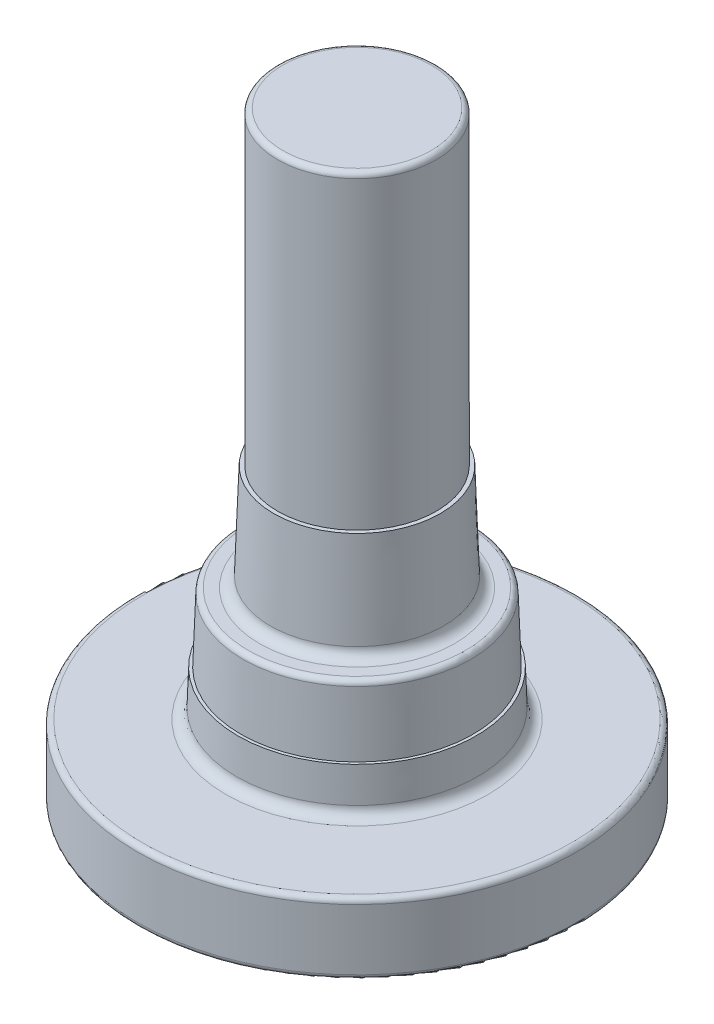
ISO-10303-21;
HEADER;
FILE_DESCRIPTION(('STEP AP214'),'2;1');
FILE_NAME('part.step','',(''),(''),'','','');
FILE_SCHEMA(('AUTOMOTIVE_DESIGN { 1 0 10303 214 1 1 1 1 }'));
ENDSEC;
DATA;
#1=APPLICATION_CONTEXT('core data for automotive mechanical design processes');
#2=APPLICATION_PROTOCOL_DEFINITION('international standard','automotive_design',2000,#1);
#3=PRODUCT_CONTEXT('',#1,'mechanical');
#4=PRODUCT('Part','Part','',(#3));
#5=PRODUCT_RELATED_PRODUCT_CATEGORY('part','',(#4));
#6=PRODUCT_DEFINITION_FORMATION('','',#4);
#7=PRODUCT_DEFINITION_CONTEXT('part definition',#1,'design');
#8=PRODUCT_DEFINITION('design','',#6,#7);
#9=PRODUCT_DEFINITION_SHAPE('','',#8);
#10=(LENGTH_UNIT() NAMED_UNIT(*) SI_UNIT(.MILLI.,.METRE.));
#11=(NAMED_UNIT(*) PLANE_ANGLE_UNIT() SI_UNIT($,.RADIAN.));
#12=(NAMED_UNIT(*) SI_UNIT($,.STERADIAN.) SOLID_ANGLE_UNIT());
#13=UNCERTAINTY_MEASURE_WITH_UNIT(LENGTH_MEASURE(1.E-05),#10,'distance_accuracy_value','');
#14=(GEOMETRIC_REPRESENTATION_CONTEXT(3) GLOBAL_UNCERTAINTY_ASSIGNED_CONTEXT((#13)) GLOBAL_UNIT_ASSIGNED_CONTEXT((#10,
#11,#12)) REPRESENTATION_CONTEXT('',''));
#15=CARTESIAN_POINT('',(0.,0.,0.));
#16=DIRECTION('',(0.,0.,1.));
#17=DIRECTION('',(1.,0.,0.));
#18=AXIS2_PLACEMENT_3D('',#15,#16,#17);
#19=CARTESIAN_POINT('',(0.,-34.7867167919799,0.));
#20=DIRECTION('',(0.,1.,0.));
#21=DIRECTION('',(0.,0.,1.));
#22=AXIS2_PLACEMENT_3D('',#19,#20,#21);
#23=PLANE('',#22);
#24=CARTESIAN_POINT('',(-7.,-34.7867167919799,12.));
#25=DIRECTION('',(0.,1.,0.));
#26=DIRECTION('',(0.,0.,1.));
#27=AXIS2_PLACEMENT_3D('',#24,#25,#26);
#28=CIRCLE('',#27,1.);
#29=CARTESIAN_POINT('',(-7.,-34.7867167919799,13.));
#30=VERTEX_POINT('',#29);
#31=CARTESIAN_POINT('',(-8.,-34.7867167919799,12.));
#32=VERTEX_POINT('',#31);
#33=EDGE_CURVE('E282',#30,#32,#28,.F.);
#34=ORIENTED_EDGE('',*,*,#33,.F.);
#35=DIRECTION('',(-1.,0.,0.));
#36=VECTOR('',#35,1.);
#37=CARTESIAN_POINT('',(0.,-34.7867167919799,13.));
#38=LINE('',#37,#36);
#39=CARTESIAN_POINT('',(7.,-34.7867167919799,13.));
#40=VERTEX_POINT('',#39);
#41=EDGE_CURVE('E300',#30,#40,#38,.F.);
#42=ORIENTED_EDGE('',*,*,#41,.T.);
#43=CARTESIAN_POINT('',(7.,-34.7867167919799,12.));
#44=DIRECTION('',(0.,1.,0.));
#45=DIRECTION('',(0.,0.,1.));
#46=AXIS2_PLACEMENT_3D('',#43,#44,#45);
#47=CIRCLE('',#46,1.);
#48=CARTESIAN_POINT('',(8.,-34.7867167919799,12.));
#49=VERTEX_POINT('',#48);
#50=EDGE_CURVE('E297',#49,#40,#47,.F.);
#51=ORIENTED_EDGE('',*,*,#50,.F.);
#52=DIRECTION('',(0.,0.,1.));
#53=VECTOR('',#52,1.);
#54=CARTESIAN_POINT('',(8.,-34.7867167919799,0.));
#55=LINE('',#54,#53);
#56=CARTESIAN_POINT('',(8.,-34.7867167919799,-15.));
#57=VERTEX_POINT('',#56);
#58=EDGE_CURVE('E295',#49,#57,#55,.F.);
#59=ORIENTED_EDGE('',*,*,#58,.T.);
#60=CARTESIAN_POINT('',(7.,-34.7867167919799,-15.));
#61=DIRECTION('',(0.,1.,0.));
#62=DIRECTION('',(0.,0.,1.));
#63=AXIS2_PLACEMENT_3D('',#60,#61,#62);
#64=CIRCLE('',#63,1.);
#65=CARTESIAN_POINT('',(7.,-34.7867167919799,-16.));
#66=VERTEX_POINT('',#65);
#67=EDGE_CURVE('E292',#66,#57,#64,.F.);
#68=ORIENTED_EDGE('',*,*,#67,.F.);
#69=DIRECTION('',(1.,0.,0.));
#70=VECTOR('',#69,1.);
#71=CARTESIAN_POINT('',(0.,-34.7867167919799,-16.));
#72=LINE('',#71,#70);
#73=CARTESIAN_POINT('',(-7.,-34.7867167919799,-16.));
#74=VERTEX_POINT('',#73);
#75=EDGE_CURVE('E290',#66,#74,#72,.F.);
#76=ORIENTED_EDGE('',*,*,#75,.T.);
#77=CARTESIAN_POINT('',(-7.,-34.7867167919799,-15.));
#78=DIRECTION('',(0.,1.,0.));
#79=DIRECTION('',(0.,0.,1.));
#80=AXIS2_PLACEMENT_3D('',#77,#78,#79);
#81=CIRCLE('',#80,1.);
#82=CARTESIAN_POINT('',(-8.,-34.7867167919799,-15.));
#83=VERTEX_POINT('',#82);
#84=EDGE_CURVE('E287',#83,#74,#81,.F.);
#85=ORIENTED_EDGE('',*,*,#84,.F.);
#86=DIRECTION('',(0.,0.,-1.));
#87=VECTOR('',#86,1.);
#88=CARTESIAN_POINT('',(-8.,-34.7867167919799,0.));
#89=LINE('',#88,#87);
#90=EDGE_CURVE('E285',#83,#32,#89,.F.);
#91=ORIENTED_EDGE('',*,*,#90,.T.);
#92=EDGE_LOOP('',(#34,#42,#51,#59,#68,#76,#85,#91));
#93=FACE_BOUND('',#92,.T.);
#94=CARTESIAN_POINT('',(0.,-34.7867167919799,0.));
#95=DIRECTION('',(0.,1.,0.));
#96=DIRECTION('',(0.,0.,1.));
#97=AXIS2_PLACEMENT_3D('',#94,#95,#96);
#98=CIRCLE('',#97,19.0343112251929);
#99=CARTESIAN_POINT('',(0.,-34.7867167919799,19.0343112251929));
#100=VERTEX_POINT('',#99);
#101=EDGE_CURVE('E155',#100,#100,#98,.F.);
#102=ORIENTED_EDGE('',*,*,#101,.T.);
#103=EDGE_LOOP('',(#102));
#104=FACE_BOUND('',#103,.T.);
#105=ADVANCED_FACE('F33',(#93,#104),#23,.F.);
#106=CARTESIAN_POINT('',(0.,-34.7867167919799,0.));
#107=DIRECTION('',(0.,-1.,0.));
#108=DIRECTION('',(0.,0.,-1.));
#109=AXIS2_PLACEMENT_3D('',#106,#107,#108);
#110=CONICAL_SURFACE('',#109,20.,0.0349065850398877);
#111=CARTESIAN_POINT('',(0.,-37.3216162886825,0.));
#112=DIRECTION('',(0.,1.,0.));
#113=DIRECTION('',(0.,0.,1.));
#114=AXIS2_PLACEMENT_3D('',#111,#112,#113);
#115=CIRCLE('',#114,20.0885206410091);
#116=CARTESIAN_POINT('',(0.,-37.3216162886825,20.0885206410091));
#117=VERTEX_POINT('',#116);
#118=EDGE_CURVE('E275',#117,#117,#115,.F.);
#119=ORIENTED_EDGE('',*,*,#118,.T.);
#120=EDGE_LOOP('',(#119));
#121=FACE_BOUND('',#120,.T.);
#122=CARTESIAN_POINT('',(0.,-35.7518172952774,0.));
#123=DIRECTION('',(0.,-1.,0.));
#124=DIRECTION('',(0.,0.,-1.));
#125=AXIS2_PLACEMENT_3D('',#122,#123,#124);
#126=CIRCLE('',#125,20.033702052212);
#127=CARTESIAN_POINT('',(0.,-35.7518172952774,-20.033702052212));
#128=VERTEX_POINT('',#127);
#129=EDGE_CURVE('E272',#128,#128,#126,.F.);
#130=ORIENTED_EDGE('',*,*,#129,.T.);
#131=EDGE_LOOP('',(#130));
#132=FACE_BOUND('',#131,.T.);
#133=ADVANCED_FACE('F388',(#121,#132),#110,.F.);
#134=CARTESIAN_POINT('',(20.1222226932211,-38.2867167919799,0.));
#135=DIRECTION('',(0.,1.,0.));
#136=DIRECTION('',(0.,0.,1.));
#137=AXIS2_PLACEMENT_3D('',#134,#135,#136);
#138=PLANE('',#137);
#139=CARTESIAN_POINT('',(0.,-38.2867167919799,0.));
#140=DIRECTION('',(0.,1.,0.));
#141=DIRECTION('',(0.,0.,1.));
#142=AXIS2_PLACEMENT_3D('',#139,#140,#141);
#143=CIRCLE('',#142,21.0879114680282);
#144=CARTESIAN_POINT('',(0.,-38.2867167919799,21.0879114680282));
#145=VERTEX_POINT('',#144);
#146=EDGE_CURVE('E269',#145,#145,#143,.T.);
#147=ORIENTED_EDGE('',*,*,#146,.T.);
#148=EDGE_LOOP('',(#147));
#149=FACE_BOUND('',#148,.T.);
#150=CARTESIAN_POINT('',(0.,-38.2867167919799,0.));
#151=DIRECTION('',(0.,1.,0.));
#152=DIRECTION('',(0.,0.,1.));
#153=AXIS2_PLACEMENT_3D('',#150,#151,#152);
#154=CIRCLE('',#153,40.5);
#155=CARTESIAN_POINT('',(0.,-38.2867167919799,40.5));
#156=VERTEX_POINT('',#155);
#157=EDGE_CURVE('E263',#156,#156,#154,.F.);
#158=ORIENTED_EDGE('',*,*,#157,.T.);
#159=EDGE_LOOP('',(#158));
#160=FACE_BOUND('',#159,.T.);
#161=ADVANCED_FACE('F393',(#149,#160),#138,.F.);
#162=CARTESIAN_POINT('',(0.,75.2132832080201,0.));
#163=DIRECTION('',(0.,1.,0.));
#164=DIRECTION('',(0.,0.,1.));
#165=AXIS2_PLACEMENT_3D('',#162,#163,#164);
#166=CYLINDRICAL_SURFACE('',#165,41.5);
#167=CARTESIAN_POINT('',(0.,-37.2867167919799,0.));
#168=DIRECTION('',(0.,1.,0.));
#169=DIRECTION('',(0.,0.,1.));
#170=AXIS2_PLACEMENT_3D('',#167,#168,#169);
#171=CIRCLE('',#170,41.5);
#172=CARTESIAN_POINT('',(0.,-37.2867167919799,41.5));
#173=VERTEX_POINT('',#172);
#174=EDGE_CURVE('E260',#173,#173,#171,.T.);
#175=ORIENTED_EDGE('',*,*,#174,.T.);
#176=EDGE_LOOP('',(#175));
#177=FACE_BOUND('',#176,.T.);
#178=CARTESIAN_POINT('',(0.,-25.7867167919799,0.));
#179=DIRECTION('',(0.,-1.,0.));
#180=DIRECTION('',(0.,0.,-1.));
#181=AXIS2_PLACEMENT_3D('',#178,#179,#180);
#182=CIRCLE('',#181,41.5);
#183=CARTESIAN_POINT('',(0.,-25.7867167919799,-41.5));
#184=VERTEX_POINT('',#183);
#185=EDGE_CURVE('E257',#184,#184,#182,.T.);
#186=ORIENTED_EDGE('',*,*,#185,.T.);
#187=EDGE_LOOP('',(#186));
#188=FACE_BOUND('',#187,.T.);
#189=ADVANCED_FACE('F483',(#177,#188),#166,.T.);
#190=CARTESIAN_POINT('',(41.5,-24.7867167919799,0.));
#191=DIRECTION('',(0.,-1.,0.));
#192=DIRECTION('',(0.,0.,-1.));
#193=AXIS2_PLACEMENT_3D('',#190,#191,#192);
#194=PLANE('',#193);
#195=CARTESIAN_POINT('',(0.,-24.7867167919799,0.));
#196=DIRECTION('',(0.,-1.,0.));
#197=DIRECTION('',(0.,0.,-1.));
#198=AXIS2_PLACEMENT_3D('',#195,#196,#197);
#199=CIRCLE('',#198,40.5);
#200=CARTESIAN_POINT('',(0.,-24.7867167919799,-40.5));
#201=VERTEX_POINT('',#200);
#202=EDGE_CURVE('E266',#201,#201,#199,.F.);
#203=ORIENTED_EDGE('',*,*,#202,.T.);
#204=EDGE_LOOP('',(#203));
#205=FACE_BOUND('',#204,.T.);
#206=CARTESIAN_POINT('',(0.,-24.7867167919799,0.));
#207=DIRECTION('',(0.,-1.,0.));
#208=DIRECTION('',(0.,0.,-1.));
#209=AXIS2_PLACEMENT_3D('',#206,#207,#208);
#210=CIRCLE('',#209,24.728204090294);
#211=CARTESIAN_POINT('',(0.,-24.7867167919799,-24.728204090294));
#212=VERTEX_POINT('',#211);
#213=EDGE_CURVE('E236',#212,#212,#210,.T.);
#214=ORIENTED_EDGE('',*,*,#213,.T.);
#215=EDGE_LOOP('',(#214));
#216=FACE_BOUND('',#215,.T.);
#217=ADVANCED_FACE('F479',(#205,#216),#194,.F.);
#218=CARTESIAN_POINT('',(0.,-24.7867167919799,0.));
#219=DIRECTION('',(0.,-1.,0.));
#220=DIRECTION('',(0.,0.,-1.));
#221=AXIS2_PLACEMENT_3D('',#218,#219,#220);
#222=CONICAL_SURFACE('',#221,22.7968265406798,0.0349065850398796);
#223=CARTESIAN_POINT('',(0.,-22.8565157853849,0.));
#224=DIRECTION('',(0.,-1.,0.));
#225=DIRECTION('',(0.,0.,-1.));
#226=AXIS2_PLACEMENT_3D('',#223,#224,#225);
#227=CIRCLE('',#226,22.7294224362558);
#228=CARTESIAN_POINT('',(0.,-22.8565157853849,-22.7294224362558));
#229=VERTEX_POINT('',#228);
#230=EDGE_CURVE('E233',#229,#229,#227,.F.);
#231=ORIENTED_EDGE('',*,*,#230,.T.);
#232=EDGE_LOOP('',(#231));
#233=FACE_BOUND('',#232,.T.);
#234=CARTESIAN_POINT('',(0.,-16.2867167919799,0.));
#235=DIRECTION('',(0.,1.,0.));
#236=DIRECTION('',(0.,0.,1.));
#237=AXIS2_PLACEMENT_3D('',#234,#235,#236);
#238=CIRCLE('',#237,22.5);
#239=CARTESIAN_POINT('',(0.,-16.2867167919799,22.5));
#240=VERTEX_POINT('',#239);
#241=EDGE_CURVE('E230',#240,#240,#238,.T.);
#242=ORIENTED_EDGE('',*,*,#241,.F.);
#243=EDGE_LOOP('',(#242));
#244=FACE_BOUND('',#243,.T.);
#245=ADVANCED_FACE('F475',(#233,#244),#222,.T.);
#246=CARTESIAN_POINT('',(22.5,-16.2867167919799,0.));
#247=DIRECTION('',(0.,-1.,0.));
#248=DIRECTION('',(0.,0.,-1.));
#249=AXIS2_PLACEMENT_3D('',#246,#247,#248);
#250=PLANE('',#249);
#251=CARTESIAN_POINT('',(0.,-16.2867167919799,0.));
#252=DIRECTION('',(0.,1.,0.));
#253=DIRECTION('',(0.,0.,1.));
#254=AXIS2_PLACEMENT_3D('',#251,#252,#253);
#255=CIRCLE('',#254,21.9539700033926);
#256=CARTESIAN_POINT('',(0.,-16.2867167919799,21.9539700033926));
#257=VERTEX_POINT('',#256);
#258=EDGE_CURVE('E225',#257,#257,#255,.T.);
#259=ORIENTED_EDGE('',*,*,#258,.F.);
#260=EDGE_LOOP('',(#259));
#261=FACE_BOUND('',#260,.T.);
#262=ORIENTED_EDGE('',*,*,#241,.T.);
#263=EDGE_LOOP('',(#262));
#264=FACE_BOUND('',#263,.T.);
#265=ADVANCED_FACE('F471',(#261,#264),#250,.F.);
#266=CARTESIAN_POINT('',(0.,-16.2867167919799,0.));
#267=DIRECTION('',(0.,-1.,0.));
#268=DIRECTION('',(0.,0.,-1.));
#269=AXIS2_PLACEMENT_3D('',#266,#267,#268);
#270=CONICAL_SURFACE('',#269,21.9539700033926,0.0349065850398797);
#271=CARTESIAN_POINT('',(0.,-4.25181729527746,0.));
#272=DIRECTION('',(0.,1.,0.));
#273=DIRECTION('',(0.,0.,1.));
#274=AXIS2_PLACEMENT_3D('',#271,#272,#273);
#275=CIRCLE('',#274,21.533702052212);
#276=CARTESIAN_POINT('',(0.,-4.25181729527746,21.533702052212));
#277=VERTEX_POINT('',#276);
#278=EDGE_CURVE('E254',#277,#277,#275,.F.);
#279=ORIENTED_EDGE('',*,*,#278,.T.);
#280=EDGE_LOOP('',(#279));
#281=FACE_BOUND('',#280,.T.);
#282=ORIENTED_EDGE('',*,*,#258,.T.);
#283=EDGE_LOOP('',(#282));
#284=FACE_BOUND('',#283,.T.);
#285=ADVANCED_FACE('F467',(#281,#284),#270,.T.);
#286=CARTESIAN_POINT('',(21.5,-3.28671679197994,0.));
#287=DIRECTION('',(0.,-1.,0.));
#288=DIRECTION('',(0.,0.,-1.));
#289=AXIS2_PLACEMENT_3D('',#286,#287,#288);
#290=PLANE('',#289);
#291=CARTESIAN_POINT('',(0.,-3.28671679197994,0.));
#292=DIRECTION('',(0.,-1.,0.));
#293=DIRECTION('',(0.,0.,-1.));
#294=AXIS2_PLACEMENT_3D('',#291,#292,#293);
#295=CIRCLE('',#294,20.5343112251929);
#296=CARTESIAN_POINT('',(0.,-3.28671679197994,-20.5343112251929));
#297=VERTEX_POINT('',#296);
#298=EDGE_CURVE('E251',#297,#297,#295,.F.);
#299=ORIENTED_EDGE('',*,*,#298,.T.);
#300=EDGE_LOOP('',(#299));
#301=FACE_BOUND('',#300,.T.);
#302=CARTESIAN_POINT('',(0.,-3.28671679197994,0.));
#303=DIRECTION('',(0.,-1.,0.));
#304=DIRECTION('',(0.,0.,-1.));
#305=AXIS2_PLACEMENT_3D('',#302,#303,#304);
#306=CIRCLE('',#305,18.379792939449);
#307=CARTESIAN_POINT('',(0.,-3.28671679197994,-18.379792939449));
#308=VERTEX_POINT('',#307);
#309=EDGE_CURVE('E242',#308,#308,#306,.T.);
#310=ORIENTED_EDGE('',*,*,#309,.T.);
#311=EDGE_LOOP('',(#310));
#312=FACE_BOUND('',#311,.T.);
#313=ADVANCED_FACE('F463',(#301,#312),#290,.F.);
#314=CARTESIAN_POINT('',(0.,-3.28671679197994,0.));
#315=DIRECTION('',(0.,-1.,0.));
#316=DIRECTION('',(0.,0.,-1.));
#317=AXIS2_PLACEMENT_3D('',#314,#315,#316);
#318=CONICAL_SURFACE('',#317,16.4484153898348,0.0349065850398798);
#319=CARTESIAN_POINT('',(0.,-1.35651578538493,0.));
#320=DIRECTION('',(0.,-1.,0.));
#321=DIRECTION('',(0.,0.,-1.));
#322=AXIS2_PLACEMENT_3D('',#319,#320,#321);
#323=CIRCLE('',#322,16.3810112854108);
#324=CARTESIAN_POINT('',(0.,-1.35651578538493,-16.3810112854108));
#325=VERTEX_POINT('',#324);
#326=EDGE_CURVE('E239',#325,#325,#323,.F.);
#327=ORIENTED_EDGE('',*,*,#326,.T.);
#328=EDGE_LOOP('',(#327));
#329=FACE_BOUND('',#328,.T.);
#330=CARTESIAN_POINT('',(0.,16.7132832080201,0.));
#331=DIRECTION('',(0.,1.,0.));
#332=DIRECTION('',(0.,0.,1.));
#333=AXIS2_PLACEMENT_3D('',#330,#331,#332);
#334=CIRCLE('',#333,15.75);
#335=CARTESIAN_POINT('',(0.,16.7132832080201,15.75));
#336=VERTEX_POINT('',#335);
#337=EDGE_CURVE('E220',#336,#336,#334,.T.);
#338=ORIENTED_EDGE('',*,*,#337,.F.);
#339=EDGE_LOOP('',(#338));
#340=FACE_BOUND('',#339,.T.);
#341=ADVANCED_FACE('F459',(#329,#340),#318,.T.);
#342=CARTESIAN_POINT('',(15.75,16.7132832080201,0.));
#343=DIRECTION('',(0.,-1.,0.));
#344=DIRECTION('',(0.,0.,-1.));
#345=AXIS2_PLACEMENT_3D('',#342,#343,#344);
#346=PLANE('',#345);
#347=CARTESIAN_POINT('',(0.,16.7132832080201,0.));
#348=DIRECTION('',(0.,1.,0.));
#349=DIRECTION('',(0.,0.,1.));
#350=AXIS2_PLACEMENT_3D('',#347,#348,#349);
#351=CIRCLE('',#350,15.);
#352=CARTESIAN_POINT('',(0.,16.7132832080201,15.));
#353=VERTEX_POINT('',#352);
#354=EDGE_CURVE('E214',#353,#353,#351,.T.);
#355=ORIENTED_EDGE('',*,*,#354,.F.);
#356=EDGE_LOOP('',(#355));
#357=FACE_BOUND('',#356,.T.);
#358=ORIENTED_EDGE('',*,*,#337,.T.);
#359=EDGE_LOOP('',(#358));
#360=FACE_BOUND('',#359,.T.);
#361=ADVANCED_FACE('F455',(#357,#360),#346,.F.);
#362=CARTESIAN_POINT('',(0.,75.2132832080201,0.));
#363=DIRECTION('',(0.,1.,0.));
#364=DIRECTION('',(0.,0.,1.));
#365=AXIS2_PLACEMENT_3D('',#362,#363,#364);
#366=CYLINDRICAL_SURFACE('',#365,15.);
#367=CARTESIAN_POINT('',(0.,74.2132832080201,0.));
#368=DIRECTION('',(0.,-1.,0.));
#369=DIRECTION('',(0.,0.,-1.));
#370=AXIS2_PLACEMENT_3D('',#367,#368,#369);
#371=CIRCLE('',#370,15.);
#372=CARTESIAN_POINT('',(0.,74.2132832080201,-15.));
#373=VERTEX_POINT('',#372);
#374=EDGE_CURVE('E248',#373,#373,#371,.T.);
#375=ORIENTED_EDGE('',*,*,#374,.T.);
#376=EDGE_LOOP('',(#375));
#377=FACE_BOUND('',#376,.T.);
#378=ORIENTED_EDGE('',*,*,#354,.T.);
#379=EDGE_LOOP('',(#378));
#380=FACE_BOUND('',#379,.T.);
#381=ADVANCED_FACE('F451',(#377,#380),#366,.T.);
#382=CARTESIAN_POINT('',(15.,75.2132832080201,0.));
#383=DIRECTION('',(0.,-1.,0.));
#384=DIRECTION('',(0.,0.,-1.));
#385=AXIS2_PLACEMENT_3D('',#382,#383,#384);
#386=PLANE('',#385);
#387=CARTESIAN_POINT('',(0.,75.2132832080201,0.));
#388=DIRECTION('',(0.,-1.,0.));
#389=DIRECTION('',(0.,0.,-1.));
#390=AXIS2_PLACEMENT_3D('',#387,#388,#389);
#391=CIRCLE('',#390,14.);
#392=CARTESIAN_POINT('',(0.,75.2132832080201,-14.));
#393=VERTEX_POINT('',#392);
#394=EDGE_CURVE('E245',#393,#393,#391,.F.);
#395=ORIENTED_EDGE('',*,*,#394,.T.);
#396=EDGE_LOOP('',(#395));
#397=FACE_BOUND('',#396,.T.);
#398=ADVANCED_FACE('F402',(#397),#386,.F.);
#399=CARTESIAN_POINT('',(0.,-22.7867167919799,0.));
#400=DIRECTION('',(0.,-1.,0.));
#401=DIRECTION('',(0.,0.,-1.));
#402=AXIS2_PLACEMENT_3D('',#399,#400,#401);
#403=TOROIDAL_SURFACE('',#402,24.728204090294,2.);
#404=ORIENTED_EDGE('',*,*,#213,.F.);
#405=EDGE_LOOP('',(#404));
#406=FACE_BOUND('',#405,.T.);
#407=ORIENTED_EDGE('',*,*,#230,.F.);
#408=EDGE_LOOP('',(#407));
#409=FACE_BOUND('',#408,.T.);
#410=ADVANCED_FACE('F398',(#406,#409),#403,.F.);
#411=CARTESIAN_POINT('',(0.,-1.28671679197994,0.));
#412=DIRECTION('',(0.,-1.,0.));
#413=DIRECTION('',(0.,0.,-1.));
#414=AXIS2_PLACEMENT_3D('',#411,#412,#413);
#415=TOROIDAL_SURFACE('',#414,18.379792939449,2.);
#416=ORIENTED_EDGE('',*,*,#309,.F.);
#417=EDGE_LOOP('',(#416));
#418=FACE_BOUND('',#417,.T.);
#419=ORIENTED_EDGE('',*,*,#326,.F.);
#420=EDGE_LOOP('',(#419));
#421=FACE_BOUND('',#420,.T.);
#422=ADVANCED_FACE('F401',(#418,#421),#415,.F.);
#423=CARTESIAN_POINT('',(0.,74.2132832080201,0.));
#424=DIRECTION('',(0.,-1.,0.));
#425=DIRECTION('',(0.,0.,-1.));
#426=AXIS2_PLACEMENT_3D('',#423,#424,#425);
#427=TOROIDAL_SURFACE('',#426,14.,1.);
#428=ORIENTED_EDGE('',*,*,#374,.F.);
#429=EDGE_LOOP('',(#428));
#430=FACE_BOUND('',#429,.T.);
#431=ORIENTED_EDGE('',*,*,#394,.F.);
#432=EDGE_LOOP('',(#431));
#433=FACE_BOUND('',#432,.T.);
#434=ADVANCED_FACE('F406',(#430,#433),#427,.T.);
#435=CARTESIAN_POINT('',(0.,-4.28671679197994,0.));
#436=DIRECTION('',(0.,-1.,0.));
#437=DIRECTION('',(0.,0.,-1.));
#438=AXIS2_PLACEMENT_3D('',#435,#436,#437);
#439=TOROIDAL_SURFACE('',#438,20.5343112251929,1.);
#440=ORIENTED_EDGE('',*,*,#278,.F.);
#441=EDGE_LOOP('',(#440));
#442=FACE_BOUND('',#441,.T.);
#443=ORIENTED_EDGE('',*,*,#298,.F.);
#444=EDGE_LOOP('',(#443));
#445=FACE_BOUND('',#444,.T.);
#446=ADVANCED_FACE('F410',(#442,#445),#439,.T.);
#447=CARTESIAN_POINT('',(0.,-37.2867167919799,0.));
#448=DIRECTION('',(0.,1.,0.));
#449=DIRECTION('',(0.,0.,1.));
#450=AXIS2_PLACEMENT_3D('',#447,#448,#449);
#451=TOROIDAL_SURFACE('',#450,40.5,1.);
#452=ORIENTED_EDGE('',*,*,#157,.F.);
#453=EDGE_LOOP('',(#452));
#454=FACE_BOUND('',#453,.T.);
#455=ORIENTED_EDGE('',*,*,#174,.F.);
#456=EDGE_LOOP('',(#455));
#457=FACE_BOUND('',#456,.T.);
#458=ADVANCED_FACE('F414',(#454,#457),#451,.T.);
#459=CARTESIAN_POINT('',(0.,-25.7867167919799,0.));
#460=DIRECTION('',(0.,-1.,0.));
#461=DIRECTION('',(0.,0.,-1.));
#462=AXIS2_PLACEMENT_3D('',#459,#460,#461);
#463=TOROIDAL_SURFACE('',#462,40.5,1.);
#464=ORIENTED_EDGE('',*,*,#185,.F.);
#465=EDGE_LOOP('',(#464));
#466=FACE_BOUND('',#465,.T.);
#467=ORIENTED_EDGE('',*,*,#202,.F.);
#468=EDGE_LOOP('',(#467));
#469=FACE_BOUND('',#468,.T.);
#470=ADVANCED_FACE('F418',(#466,#469),#463,.T.);
#471=CARTESIAN_POINT('',(0.,-37.2867167919799,0.));
#472=DIRECTION('',(0.,1.,0.));
#473=DIRECTION('',(0.,0.,1.));
#474=AXIS2_PLACEMENT_3D('',#471,#472,#473);
#475=TOROIDAL_SURFACE('',#474,21.0879114680282,1.);
#476=ORIENTED_EDGE('',*,*,#118,.F.);
#477=EDGE_LOOP('',(#476));
#478=FACE_BOUND('',#477,.T.);
#479=ORIENTED_EDGE('',*,*,#146,.F.);
#480=EDGE_LOOP('',(#479));
#481=FACE_BOUND('',#480,.T.);
#482=ADVANCED_FACE('F422',(#478,#481),#475,.T.);
#483=CARTESIAN_POINT('',(0.,-35.7867167919799,0.));
#484=DIRECTION('',(0.,1.,0.));
#485=DIRECTION('',(0.,0.,1.));
#486=AXIS2_PLACEMENT_3D('',#483,#484,#485);
#487=TOROIDAL_SURFACE('',#486,19.0343112251929,1.);
#488=ORIENTED_EDGE('',*,*,#101,.F.);
#489=EDGE_LOOP('',(#488));
#490=FACE_BOUND('',#489,.T.);
#491=ORIENTED_EDGE('',*,*,#129,.F.);
#492=EDGE_LOOP('',(#491));
#493=FACE_BOUND('',#492,.T.);
#494=ADVANCED_FACE('F425',(#490,#493),#487,.F.);
#495=CARTESIAN_POINT('',(7.5,-27.7867167919799,12.5));
#496=DIRECTION('',(1.,0.,0.));
#497=DIRECTION('',(0.,0.,-1.));
#498=AXIS2_PLACEMENT_3D('',#495,#496,#497);
#499=PLANE('',#498);
#500=DIRECTION('',(0.,-1.,0.));
#501=VECTOR('',#500,1.);
#502=CARTESIAN_POINT('',(7.5,-27.7867167919799,12.));
#503=LINE('',#502,#501);
#504=CARTESIAN_POINT('',(7.5,-34.2867167919799,12.));
#505=VERTEX_POINT('',#504);
#506=CARTESIAN_POINT('',(7.5,-28.2867167919799,12.));
#507=VERTEX_POINT('',#506);
#508=EDGE_CURVE('E314',#505,#507,#503,.F.);
#509=ORIENTED_EDGE('',*,*,#508,.T.);
#510=DIRECTION('',(0.,0.,1.));
#511=VECTOR('',#510,1.);
#512=CARTESIAN_POINT('',(7.5,-28.2867167919799,12.5));
#513=LINE('',#512,#511);
#514=CARTESIAN_POINT('',(7.5,-28.2867167919799,-15.));
#515=VERTEX_POINT('',#514);
#516=EDGE_CURVE('E317',#507,#515,#513,.F.);
#517=ORIENTED_EDGE('',*,*,#516,.T.);
#518=DIRECTION('',(0.,-1.,0.));
#519=VECTOR('',#518,1.);
#520=CARTESIAN_POINT('',(7.5,-34.7867167919799,-15.));
#521=LINE('',#520,#519);
#522=CARTESIAN_POINT('',(7.5,-34.2867167919799,-15.));
#523=VERTEX_POINT('',#522);
#524=EDGE_CURVE('E312',#515,#523,#521,.T.);
#525=ORIENTED_EDGE('',*,*,#524,.T.);
#526=DIRECTION('',(0.,0.,1.));
#527=VECTOR('',#526,1.);
#528=CARTESIAN_POINT('',(7.5,-34.2867167919799,12.5));
#529=LINE('',#528,#527);
#530=EDGE_CURVE('E310',#523,#505,#529,.T.);
#531=ORIENTED_EDGE('',*,*,#530,.T.);
#532=EDGE_LOOP('',(#509,#517,#525,#531));
#533=FACE_BOUND('',#532,.T.);
#534=ADVANCED_FACE('F428',(#533),#499,.F.);
#535=CARTESIAN_POINT('',(-7.5,-27.7867167919799,-15.5));
#536=DIRECTION('',(0.,0.,-1.));
#537=DIRECTION('',(-1.,0.,0.));
#538=AXIS2_PLACEMENT_3D('',#535,#536,#537);
#539=PLANE('',#538);
#540=DIRECTION('',(0.,-1.,0.));
#541=VECTOR('',#540,1.);
#542=CARTESIAN_POINT('',(7.,-27.7867167919799,-15.5));
#543=LINE('',#542,#541);
#544=CARTESIAN_POINT('',(7.,-34.2867167919799,-15.5));
#545=VERTEX_POINT('',#544);
#546=CARTESIAN_POINT('',(7.,-28.2867167919799,-15.5));
#547=VERTEX_POINT('',#546);
#548=EDGE_CURVE('E323',#545,#547,#543,.F.);
#549=ORIENTED_EDGE('',*,*,#548,.T.);
#550=DIRECTION('',(1.,0.,0.));
#551=VECTOR('',#550,1.);
#552=CARTESIAN_POINT('',(-7.5,-28.2867167919799,-15.5));
#553=LINE('',#552,#551);
#554=CARTESIAN_POINT('',(-7.,-28.2867167919799,-15.5));
#555=VERTEX_POINT('',#554);
#556=EDGE_CURVE('E326',#547,#555,#553,.F.);
#557=ORIENTED_EDGE('',*,*,#556,.T.);
#558=DIRECTION('',(0.,-1.,0.));
#559=VECTOR('',#558,1.);
#560=CARTESIAN_POINT('',(-7.,-34.7867167919799,-15.5));
#561=LINE('',#560,#559);
#562=CARTESIAN_POINT('',(-7.,-34.2867167919799,-15.5));
#563=VERTEX_POINT('',#562);
#564=EDGE_CURVE('E321',#555,#563,#561,.T.);
#565=ORIENTED_EDGE('',*,*,#564,.T.);
#566=DIRECTION('',(1.,0.,0.));
#567=VECTOR('',#566,1.);
#568=CARTESIAN_POINT('',(-7.5,-34.2867167919799,-15.5));
#569=LINE('',#568,#567);
#570=EDGE_CURVE('E319',#563,#545,#569,.T.);
#571=ORIENTED_EDGE('',*,*,#570,.T.);
#572=EDGE_LOOP('',(#549,#557,#565,#571));
#573=FACE_BOUND('',#572,.T.);
#574=ADVANCED_FACE('F433',(#573),#539,.F.);
#575=CARTESIAN_POINT('',(-7.5,-27.7867167919799,12.5));
#576=DIRECTION('',(-1.,0.,0.));
#577=DIRECTION('',(0.,0.,1.));
#578=AXIS2_PLACEMENT_3D('',#575,#576,#577);
#579=PLANE('',#578);
#580=DIRECTION('',(0.,-1.,0.));
#581=VECTOR('',#580,1.);
#582=CARTESIAN_POINT('',(-7.5,-27.7867167919799,-15.));
#583=LINE('',#582,#581);
#584=CARTESIAN_POINT('',(-7.5,-34.2867167919799,-15.));
#585=VERTEX_POINT('',#584);
#586=CARTESIAN_POINT('',(-7.5,-28.2867167919799,-15.));
#587=VERTEX_POINT('',#586);
#588=EDGE_CURVE('E305',#585,#587,#583,.F.);
#589=ORIENTED_EDGE('',*,*,#588,.T.);
#590=DIRECTION('',(0.,0.,-1.));
#591=VECTOR('',#590,1.);
#592=CARTESIAN_POINT('',(-7.5,-28.2867167919799,12.5));
#593=LINE('',#592,#591);
#594=CARTESIAN_POINT('',(-7.5,-28.2867167919799,12.));
#595=VERTEX_POINT('',#594);
#596=EDGE_CURVE('E308',#587,#595,#593,.F.);
#597=ORIENTED_EDGE('',*,*,#596,.T.);
#598=DIRECTION('',(0.,-1.,0.));
#599=VECTOR('',#598,1.);
#600=CARTESIAN_POINT('',(-7.5,-34.7867167919799,12.));
#601=LINE('',#600,#599);
#602=CARTESIAN_POINT('',(-7.5,-34.2867167919799,12.));
#603=VERTEX_POINT('',#602);
#604=EDGE_CURVE('E167',#595,#603,#601,.T.);
#605=ORIENTED_EDGE('',*,*,#604,.T.);
#606=DIRECTION('',(0.,0.,-1.));
#607=VECTOR('',#606,1.);
#608=CARTESIAN_POINT('',(-7.5,-34.2867167919799,12.5));
#609=LINE('',#608,#607);
#610=EDGE_CURVE('E303',#603,#585,#609,.T.);
#611=ORIENTED_EDGE('',*,*,#610,.T.);
#612=EDGE_LOOP('',(#589,#597,#605,#611));
#613=FACE_BOUND('',#612,.T.);
#614=ADVANCED_FACE('F443',(#613),#579,.F.);
#615=CARTESIAN_POINT('',(-7.5,-27.7867167919799,12.5));
#616=DIRECTION('',(0.,0.,1.));
#617=DIRECTION('',(1.,0.,0.));
#618=AXIS2_PLACEMENT_3D('',#615,#616,#617);
#619=PLANE('',#618);
#620=DIRECTION('',(0.,-1.,0.));
#621=VECTOR('',#620,1.);
#622=CARTESIAN_POINT('',(7.,-34.7867167919799,12.5));
#623=LINE('',#622,#621);
#624=CARTESIAN_POINT('',(7.,-28.2867167919799,12.5));
#625=VERTEX_POINT('',#624);
#626=CARTESIAN_POINT('',(7.,-34.2867167919799,12.5));
#627=VERTEX_POINT('',#626);
#628=EDGE_CURVE('E144',#625,#627,#623,.T.);
#629=ORIENTED_EDGE('',*,*,#628,.T.);
#630=DIRECTION('',(-1.,0.,0.));
#631=VECTOR('',#630,1.);
#632=CARTESIAN_POINT('',(-7.5,-34.2867167919799,12.5));
#633=LINE('',#632,#631);
#634=CARTESIAN_POINT('',(-7.,-34.2867167919799,12.5));
#635=VERTEX_POINT('',#634);
#636=EDGE_CURVE('E140',#627,#635,#633,.T.);
#637=ORIENTED_EDGE('',*,*,#636,.T.);
#638=DIRECTION('',(0.,-1.,0.));
#639=VECTOR('',#638,1.);
#640=CARTESIAN_POINT('',(-7.,-27.7867167919799,12.5));
#641=LINE('',#640,#639);
#642=CARTESIAN_POINT('',(-7.,-28.2867167919799,12.5));
#643=VERTEX_POINT('',#642);
#644=EDGE_CURVE('E134',#635,#643,#641,.F.);
#645=ORIENTED_EDGE('',*,*,#644,.T.);
#646=DIRECTION('',(-1.,0.,0.));
#647=VECTOR('',#646,1.);
#648=CARTESIAN_POINT('',(-7.5,-28.2867167919799,12.5));
#649=LINE('',#648,#647);
#650=EDGE_CURVE('E137',#643,#625,#649,.F.);
#651=ORIENTED_EDGE('',*,*,#650,.T.);
#652=EDGE_LOOP('',(#629,#637,#645,#651));
#653=FACE_BOUND('',#652,.T.);
#654=ADVANCED_FACE('F136',(#653),#619,.F.);
#655=CARTESIAN_POINT('',(7.5,-27.7867167919799,-15.5));
#656=DIRECTION('',(0.,-1.,0.));
#657=DIRECTION('',(0.,0.,-1.));
#658=AXIS2_PLACEMENT_3D('',#655,#656,#657);
#659=PLANE('',#658);
#660=DIRECTION('',(0.,0.,1.));
#661=VECTOR('',#660,1.);
#662=CARTESIAN_POINT('',(7.,-27.7867167919799,-15.5));
#663=LINE('',#662,#661);
#664=CARTESIAN_POINT('',(7.,-27.7867167919799,-15.));
#665=VERTEX_POINT('',#664);
#666=CARTESIAN_POINT('',(7.,-27.7867167919799,12.));
#667=VERTEX_POINT('',#666);
#668=EDGE_CURVE('E42',#665,#667,#663,.T.);
#669=ORIENTED_EDGE('',*,*,#668,.T.);
#670=DIRECTION('',(-1.,0.,0.));
#671=VECTOR('',#670,1.);
#672=CARTESIAN_POINT('',(7.50000000000001,-27.7867167919799,12.));
#673=LINE('',#672,#671);
#674=CARTESIAN_POINT('',(-7.,-27.7867167919799,12.));
#675=VERTEX_POINT('',#674);
#676=EDGE_CURVE('E11',#667,#675,#673,.T.);
#677=ORIENTED_EDGE('',*,*,#676,.T.);
#678=DIRECTION('',(0.,0.,-1.));
#679=VECTOR('',#678,1.);
#680=CARTESIAN_POINT('',(-7.,-27.7867167919799,-15.5));
#681=LINE('',#680,#679);
#682=CARTESIAN_POINT('',(-7.,-27.7867167919799,-15.));
#683=VERTEX_POINT('',#682);
#684=EDGE_CURVE('E328',#675,#683,#681,.T.);
#685=ORIENTED_EDGE('',*,*,#684,.T.);
#686=DIRECTION('',(1.,0.,0.));
#687=VECTOR('',#686,1.);
#688=CARTESIAN_POINT('',(7.5,-27.7867167919799,-15.));
#689=LINE('',#688,#687);
#690=EDGE_CURVE('E53',#683,#665,#689,.T.);
#691=ORIENTED_EDGE('',*,*,#690,.T.);
#692=EDGE_LOOP('',(#669,#677,#685,#691));
#693=FACE_BOUND('',#692,.T.);
#694=ADVANCED_FACE('F614',(#693),#659,.T.);
#695=CARTESIAN_POINT('',(7.5,-28.2867167919799,-15.));
#696=DIRECTION('',(1.,0.,0.));
#697=DIRECTION('',(0.,0.,-1.));
#698=AXIS2_PLACEMENT_3D('',#695,#696,#697);
#699=CYLINDRICAL_SURFACE('',#698,0.5);
#700=CARTESIAN_POINT('',(7.,-28.2867167919799,-15.));
#701=DIRECTION('',(-1.,0.,0.));
#702=DIRECTION('',(0.,0.,1.));
#703=AXIS2_PLACEMENT_3D('',#700,#701,#702);
#704=CIRCLE('',#703,0.5);
#705=EDGE_CURVE('E37',#665,#547,#704,.T.);
#706=ORIENTED_EDGE('',*,*,#705,.F.);
#707=ORIENTED_EDGE('',*,*,#690,.F.);
#708=CARTESIAN_POINT('',(-7.,-28.2867167919799,-15.));
#709=DIRECTION('',(1.,0.,0.));
#710=DIRECTION('',(0.,0.,-1.));
#711=AXIS2_PLACEMENT_3D('',#708,#709,#710);
#712=CIRCLE('',#711,0.5);
#713=EDGE_CURVE('E207',#555,#683,#712,.T.);
#714=ORIENTED_EDGE('',*,*,#713,.F.);
#715=ORIENTED_EDGE('',*,*,#556,.F.);
#716=EDGE_LOOP('',(#706,#707,#714,#715));
#717=FACE_BOUND('',#716,.T.);
#718=ADVANCED_FACE('F35',(#717),#699,.F.);
#719=CARTESIAN_POINT('',(7.,-28.2867167919799,-15.));
#720=DIRECTION('',(0.,0.,1.));
#721=DIRECTION('',(1.,0.,0.));
#722=AXIS2_PLACEMENT_3D('',#719,#720,#721);
#723=SPHERICAL_SURFACE('',#722,0.5);
#724=CARTESIAN_POINT('',(7.,-28.2867167919799,-15.));
#725=DIRECTION('',(0.,0.,1.));
#726=DIRECTION('',(1.,0.,0.));
#727=AXIS2_PLACEMENT_3D('',#724,#725,#726);
#728=CIRCLE('',#727,0.5);
#729=EDGE_CURVE('E203',#665,#515,#728,.F.);
#730=ORIENTED_EDGE('',*,*,#729,.F.);
#731=ORIENTED_EDGE('',*,*,#705,.T.);
#732=CARTESIAN_POINT('',(7.,-28.2867167919799,-15.));
#733=DIRECTION('',(0.,-1.,0.));
#734=DIRECTION('',(0.,0.,-1.));
#735=AXIS2_PLACEMENT_3D('',#732,#733,#734);
#736=CIRCLE('',#735,0.5);
#737=EDGE_CURVE('E206',#515,#547,#736,.F.);
#738=ORIENTED_EDGE('',*,*,#737,.F.);
#739=EDGE_LOOP('',(#730,#731,#738));
#740=FACE_BOUND('',#739,.T.);
#741=ADVANCED_FACE('F630',(#740),#723,.F.);
#742=CARTESIAN_POINT('',(-7.,-28.2867167919799,-15.));
#743=DIRECTION('',(0.,0.,1.));
#744=DIRECTION('',(1.,0.,0.));
#745=AXIS2_PLACEMENT_3D('',#742,#743,#744);
#746=SPHERICAL_SURFACE('',#745,0.5);
#747=CARTESIAN_POINT('',(-7.,-28.2867167919799,-15.));
#748=DIRECTION('',(0.,-1.,0.));
#749=DIRECTION('',(0.,0.,-1.));
#750=AXIS2_PLACEMENT_3D('',#747,#748,#749);
#751=CIRCLE('',#750,0.5);
#752=EDGE_CURVE('E197',#555,#587,#751,.F.);
#753=ORIENTED_EDGE('',*,*,#752,.F.);
#754=ORIENTED_EDGE('',*,*,#713,.T.);
#755=CARTESIAN_POINT('',(-7.,-28.2867167919799,-15.));
#756=DIRECTION('',(0.,0.,1.));
#757=DIRECTION('',(1.,0.,0.));
#758=AXIS2_PLACEMENT_3D('',#755,#756,#757);
#759=CIRCLE('',#758,0.5);
#760=EDGE_CURVE('E200',#587,#683,#759,.F.);
#761=ORIENTED_EDGE('',*,*,#760,.F.);
#762=EDGE_LOOP('',(#753,#754,#761));
#763=FACE_BOUND('',#762,.T.);
#764=ADVANCED_FACE('F639',(#763),#746,.F.);
#765=CARTESIAN_POINT('',(7.,-27.7867167919799,-15.));
#766=DIRECTION('',(0.,1.,0.));
#767=DIRECTION('',(0.,0.,1.));
#768=AXIS2_PLACEMENT_3D('',#765,#766,#767);
#769=CYLINDRICAL_SURFACE('',#768,0.5);
#770=ORIENTED_EDGE('',*,*,#737,.T.);
#771=ORIENTED_EDGE('',*,*,#548,.F.);
#772=CARTESIAN_POINT('',(7.,-34.2867167919799,-15.));
#773=DIRECTION('',(0.,1.,0.));
#774=DIRECTION('',(0.,0.,1.));
#775=AXIS2_PLACEMENT_3D('',#772,#773,#774);
#776=CIRCLE('',#775,0.5);
#777=EDGE_CURVE('E191',#523,#545,#776,.T.);
#778=ORIENTED_EDGE('',*,*,#777,.F.);
#779=ORIENTED_EDGE('',*,*,#524,.F.);
#780=EDGE_LOOP('',(#770,#771,#778,#779));
#781=FACE_BOUND('',#780,.T.);
#782=ADVANCED_FACE('F647',(#781),#769,.F.);
#783=CARTESIAN_POINT('',(7.,-28.2867167919799,-15.5));
#784=DIRECTION('',(0.,0.,1.));
#785=DIRECTION('',(1.,0.,0.));
#786=AXIS2_PLACEMENT_3D('',#783,#784,#785);
#787=CYLINDRICAL_SURFACE('',#786,0.5);
#788=ORIENTED_EDGE('',*,*,#729,.T.);
#789=ORIENTED_EDGE('',*,*,#516,.F.);
#790=CARTESIAN_POINT('',(7.,-28.2867167919799,12.));
#791=DIRECTION('',(0.,0.,-1.));
#792=DIRECTION('',(-1.,0.,0.));
#793=AXIS2_PLACEMENT_3D('',#790,#791,#792);
#794=CIRCLE('',#793,0.5);
#795=EDGE_CURVE('E188',#667,#507,#794,.T.);
#796=ORIENTED_EDGE('',*,*,#795,.F.);
#797=ORIENTED_EDGE('',*,*,#668,.F.);
#798=EDGE_LOOP('',(#788,#789,#796,#797));
#799=FACE_BOUND('',#798,.T.);
#800=ADVANCED_FACE('F656',(#799),#787,.F.);
#801=CARTESIAN_POINT('',(7.50000000000001,-28.2867167919799,12.));
#802=DIRECTION('',(-1.,0.,0.));
#803=DIRECTION('',(0.,0.,1.));
#804=AXIS2_PLACEMENT_3D('',#801,#802,#803);
#805=CYLINDRICAL_SURFACE('',#804,0.5);
#806=CARTESIAN_POINT('',(-7.,-28.2867167919799,12.));
#807=DIRECTION('',(1.,0.,0.));
#808=DIRECTION('',(0.,0.,-1.));
#809=AXIS2_PLACEMENT_3D('',#806,#807,#808);
#810=CIRCLE('',#809,0.5);
#811=EDGE_CURVE('E150',#675,#643,#810,.T.);
#812=ORIENTED_EDGE('',*,*,#811,.F.);
#813=ORIENTED_EDGE('',*,*,#676,.F.);
#814=CARTESIAN_POINT('',(7.,-28.2867167919799,12.));
#815=DIRECTION('',(-1.,0.,0.));
#816=DIRECTION('',(0.,-1.,0.));
#817=AXIS2_PLACEMENT_3D('',#814,#815,#816);
#818=CIRCLE('',#817,0.5);
#819=EDGE_CURVE('E153',#625,#667,#818,.T.);
#820=ORIENTED_EDGE('',*,*,#819,.F.);
#821=ORIENTED_EDGE('',*,*,#650,.F.);
#822=EDGE_LOOP('',(#812,#813,#820,#821));
#823=FACE_BOUND('',#822,.T.);
#824=ADVANCED_FACE('F149',(#823),#805,.F.);
#825=CARTESIAN_POINT('',(-7.,-28.2867167919799,-15.5));
#826=DIRECTION('',(0.,0.,-1.));
#827=DIRECTION('',(-1.,0.,0.));
#828=AXIS2_PLACEMENT_3D('',#825,#826,#827);
#829=CYLINDRICAL_SURFACE('',#828,0.5);
#830=ORIENTED_EDGE('',*,*,#760,.T.);
#831=ORIENTED_EDGE('',*,*,#684,.F.);
#832=CARTESIAN_POINT('',(-7.,-28.2867167919799,12.));
#833=DIRECTION('',(0.,0.,-1.));
#834=DIRECTION('',(-1.,0.,0.));
#835=AXIS2_PLACEMENT_3D('',#832,#833,#834);
#836=CIRCLE('',#835,0.5);
#837=EDGE_CURVE('E163',#595,#675,#836,.T.);
#838=ORIENTED_EDGE('',*,*,#837,.F.);
#839=ORIENTED_EDGE('',*,*,#596,.F.);
#840=EDGE_LOOP('',(#830,#831,#838,#839));
#841=FACE_BOUND('',#840,.T.);
#842=ADVANCED_FACE('F675',(#841),#829,.F.);
#843=CARTESIAN_POINT('',(-7.,-27.7867167919799,-15.));
#844=DIRECTION('',(0.,1.,0.));
#845=DIRECTION('',(0.,0.,1.));
#846=AXIS2_PLACEMENT_3D('',#843,#844,#845);
#847=CYLINDRICAL_SURFACE('',#846,0.5);
#848=ORIENTED_EDGE('',*,*,#752,.T.);
#849=ORIENTED_EDGE('',*,*,#588,.F.);
#850=CARTESIAN_POINT('',(-7.,-34.2867167919799,-15.));
#851=DIRECTION('',(0.,1.,0.));
#852=DIRECTION('',(0.,0.,1.));
#853=AXIS2_PLACEMENT_3D('',#850,#851,#852);
#854=CIRCLE('',#853,0.5);
#855=EDGE_CURVE('E183',#563,#585,#854,.T.);
#856=ORIENTED_EDGE('',*,*,#855,.F.);
#857=ORIENTED_EDGE('',*,*,#564,.F.);
#858=EDGE_LOOP('',(#848,#849,#856,#857));
#859=FACE_BOUND('',#858,.T.);
#860=ADVANCED_FACE('F684',(#859),#847,.F.);
#861=CARTESIAN_POINT('',(-7.5,-34.2867167919799,-16.));
#862=DIRECTION('',(1.,0.,0.));
#863=DIRECTION('',(0.,0.,-1.));
#864=AXIS2_PLACEMENT_3D('',#861,#862,#863);
#865=CYLINDRICAL_SURFACE('',#864,0.5);
#866=CARTESIAN_POINT('',(-7.,-34.2867167919799,-16.));
#867=DIRECTION('',(-1.,0.,0.));
#868=DIRECTION('',(0.,0.,1.));
#869=AXIS2_PLACEMENT_3D('',#866,#867,#868);
#870=CIRCLE('',#869,0.5);
#871=EDGE_CURVE('E180',#74,#563,#870,.T.);
#872=ORIENTED_EDGE('',*,*,#871,.F.);
#873=ORIENTED_EDGE('',*,*,#75,.F.);
#874=CARTESIAN_POINT('',(7.,-34.2867167919799,-16.));
#875=DIRECTION('',(1.,0.,0.));
#876=DIRECTION('',(0.,0.,-1.));
#877=AXIS2_PLACEMENT_3D('',#874,#875,#876);
#878=CIRCLE('',#877,0.5);
#879=EDGE_CURVE('E194',#545,#66,#878,.T.);
#880=ORIENTED_EDGE('',*,*,#879,.F.);
#881=ORIENTED_EDGE('',*,*,#570,.F.);
#882=EDGE_LOOP('',(#872,#873,#880,#881));
#883=FACE_BOUND('',#882,.T.);
#884=ADVANCED_FACE('F364',(#883),#865,.T.);
#885=CARTESIAN_POINT('',(7.,-34.2867167919799,-15.));
#886=DIRECTION('',(0.,1.,0.));
#887=DIRECTION('',(0.,0.,1.));
#888=AXIS2_PLACEMENT_3D('',#885,#886,#887);
#889=TOROIDAL_SURFACE('',#888,1.,0.5);
#890=ORIENTED_EDGE('',*,*,#879,.T.);
#891=ORIENTED_EDGE('',*,*,#67,.T.);
#892=CARTESIAN_POINT('',(8.,-34.2867167919799,-15.));
#893=DIRECTION('',(0.,0.,-1.));
#894=DIRECTION('',(-1.,0.,0.));
#895=AXIS2_PLACEMENT_3D('',#892,#893,#894);
#896=CIRCLE('',#895,0.5);
#897=EDGE_CURVE('E171',#523,#57,#896,.F.);
#898=ORIENTED_EDGE('',*,*,#897,.F.);
#899=ORIENTED_EDGE('',*,*,#777,.T.);
#900=EDGE_LOOP('',(#890,#891,#898,#899));
#901=FACE_BOUND('',#900,.T.);
#902=ADVANCED_FACE('F358',(#901),#889,.T.);
#903=CARTESIAN_POINT('',(7.,-28.2867167919799,12.));
#904=DIRECTION('',(0.,0.,1.));
#905=DIRECTION('',(1.,0.,0.));
#906=AXIS2_PLACEMENT_3D('',#903,#904,#905);
#907=SPHERICAL_SURFACE('',#906,0.5);
#908=ORIENTED_EDGE('',*,*,#819,.T.);
#909=ORIENTED_EDGE('',*,*,#795,.T.);
#910=CARTESIAN_POINT('',(7.,-28.2867167919799,12.));
#911=DIRECTION('',(0.,-1.,0.));
#912=DIRECTION('',(0.,0.,-1.));
#913=AXIS2_PLACEMENT_3D('',#910,#911,#912);
#914=CIRCLE('',#913,0.5);
#915=EDGE_CURVE('E168',#625,#507,#914,.F.);
#916=ORIENTED_EDGE('',*,*,#915,.F.);
#917=EDGE_LOOP('',(#908,#909,#916));
#918=FACE_BOUND('',#917,.T.);
#919=ADVANCED_FACE('F711',(#918),#907,.F.);
#920=CARTESIAN_POINT('',(-7.,-28.2867167919799,12.));
#921=DIRECTION('',(0.,0.,1.));
#922=DIRECTION('',(1.,0.,0.));
#923=AXIS2_PLACEMENT_3D('',#920,#921,#922);
#924=SPHERICAL_SURFACE('',#923,0.5);
#925=ORIENTED_EDGE('',*,*,#837,.T.);
#926=ORIENTED_EDGE('',*,*,#811,.T.);
#927=CARTESIAN_POINT('',(-7.,-28.2867167919799,12.));
#928=DIRECTION('',(0.,-1.,0.));
#929=DIRECTION('',(0.,0.,-1.));
#930=AXIS2_PLACEMENT_3D('',#927,#928,#929);
#931=CIRCLE('',#930,0.5);
#932=EDGE_CURVE('E160',#595,#643,#931,.F.);
#933=ORIENTED_EDGE('',*,*,#932,.F.);
#934=EDGE_LOOP('',(#925,#926,#933));
#935=FACE_BOUND('',#934,.T.);
#936=ADVANCED_FACE('F159',(#935),#924,.F.);
#937=CARTESIAN_POINT('',(-7.,-34.2867167919799,-15.));
#938=DIRECTION('',(0.,1.,0.));
#939=DIRECTION('',(0.,0.,1.));
#940=AXIS2_PLACEMENT_3D('',#937,#938,#939);
#941=TOROIDAL_SURFACE('',#940,1.,0.5);
#942=ORIENTED_EDGE('',*,*,#871,.T.);
#943=ORIENTED_EDGE('',*,*,#855,.T.);
#944=CARTESIAN_POINT('',(-8.,-34.2867167919799,-15.));
#945=DIRECTION('',(0.,0.,-1.));
#946=DIRECTION('',(-1.,0.,0.));
#947=AXIS2_PLACEMENT_3D('',#944,#945,#946);
#948=CIRCLE('',#947,0.5);
#949=EDGE_CURVE('E169',#83,#585,#948,.F.);
#950=ORIENTED_EDGE('',*,*,#949,.F.);
#951=ORIENTED_EDGE('',*,*,#84,.T.);
#952=EDGE_LOOP('',(#942,#943,#950,#951));
#953=FACE_BOUND('',#952,.T.);
#954=ADVANCED_FACE('F370',(#953),#941,.T.);
#955=CARTESIAN_POINT('',(8.,-34.2867167919799,12.5));
#956=DIRECTION('',(0.,0.,1.));
#957=DIRECTION('',(1.,0.,0.));
#958=AXIS2_PLACEMENT_3D('',#955,#956,#957);
#959=CYLINDRICAL_SURFACE('',#958,0.5);
#960=ORIENTED_EDGE('',*,*,#897,.T.);
#961=ORIENTED_EDGE('',*,*,#58,.F.);
#962=CARTESIAN_POINT('',(8.,-34.2867167919799,12.));
#963=DIRECTION('',(0.,0.,1.));
#964=DIRECTION('',(1.,0.,0.));
#965=AXIS2_PLACEMENT_3D('',#962,#963,#964);
#966=CIRCLE('',#965,0.5);
#967=EDGE_CURVE('E174',#505,#49,#966,.T.);
#968=ORIENTED_EDGE('',*,*,#967,.F.);
#969=ORIENTED_EDGE('',*,*,#530,.F.);
#970=EDGE_LOOP('',(#960,#961,#968,#969));
#971=FACE_BOUND('',#970,.T.);
#972=ADVANCED_FACE('F352',(#971),#959,.T.);
#973=CARTESIAN_POINT('',(7.,-27.7867167919799,12.));
#974=DIRECTION('',(0.,1.,0.));
#975=DIRECTION('',(0.,0.,1.));
#976=AXIS2_PLACEMENT_3D('',#973,#974,#975);
#977=CYLINDRICAL_SURFACE('',#976,0.5);
#978=ORIENTED_EDGE('',*,*,#915,.T.);
#979=ORIENTED_EDGE('',*,*,#508,.F.);
#980=CARTESIAN_POINT('',(7.,-34.2867167919799,12.));
#981=DIRECTION('',(0.,1.,0.));
#982=DIRECTION('',(0.,0.,1.));
#983=AXIS2_PLACEMENT_3D('',#980,#981,#982);
#984=CIRCLE('',#983,0.5);
#985=EDGE_CURVE('E341',#627,#505,#984,.T.);
#986=ORIENTED_EDGE('',*,*,#985,.F.);
#987=ORIENTED_EDGE('',*,*,#628,.F.);
#988=EDGE_LOOP('',(#978,#979,#986,#987));
#989=FACE_BOUND('',#988,.T.);
#990=ADVANCED_FACE('F745',(#989),#977,.F.);
#991=CARTESIAN_POINT('',(-7.,-27.7867167919799,12.));
#992=DIRECTION('',(0.,1.,0.));
#993=DIRECTION('',(0.,0.,1.));
#994=AXIS2_PLACEMENT_3D('',#991,#992,#993);
#995=CYLINDRICAL_SURFACE('',#994,0.5);
#996=ORIENTED_EDGE('',*,*,#932,.T.);
#997=ORIENTED_EDGE('',*,*,#644,.F.);
#998=CARTESIAN_POINT('',(-7.,-34.2867167919799,12.));
#999=DIRECTION('',(0.,1.,0.));
#1000=DIRECTION('',(0.,0.,1.));
#1001=AXIS2_PLACEMENT_3D('',#998,#999,#1000);
#1002=CIRCLE('',#1001,0.5);
#1003=EDGE_CURVE('E338',#603,#635,#1002,.T.);
#1004=ORIENTED_EDGE('',*,*,#1003,.F.);
#1005=ORIENTED_EDGE('',*,*,#604,.F.);
#1006=EDGE_LOOP('',(#996,#997,#1004,#1005));
#1007=FACE_BOUND('',#1006,.T.);
#1008=ADVANCED_FACE('F165',(#1007),#995,.F.);
#1009=CARTESIAN_POINT('',(-8.,-34.2867167919799,12.5));
#1010=DIRECTION('',(0.,0.,-1.));
#1011=DIRECTION('',(-1.,0.,0.));
#1012=AXIS2_PLACEMENT_3D('',#1009,#1010,#1011);
#1013=CYLINDRICAL_SURFACE('',#1012,0.5);
#1014=ORIENTED_EDGE('',*,*,#949,.T.);
#1015=ORIENTED_EDGE('',*,*,#610,.F.);
#1016=CARTESIAN_POINT('',(-8.,-34.2867167919799,12.));
#1017=DIRECTION('',(0.,0.,1.));
#1018=DIRECTION('',(1.,0.,0.));
#1019=AXIS2_PLACEMENT_3D('',#1016,#1017,#1018);
#1020=CIRCLE('',#1019,0.5);
#1021=EDGE_CURVE('E336',#32,#603,#1020,.T.);
#1022=ORIENTED_EDGE('',*,*,#1021,.F.);
#1023=ORIENTED_EDGE('',*,*,#90,.F.);
#1024=EDGE_LOOP('',(#1014,#1015,#1022,#1023));
#1025=FACE_BOUND('',#1024,.T.);
#1026=ADVANCED_FACE('F373',(#1025),#1013,.T.);
#1027=CARTESIAN_POINT('',(7.,-34.2867167919799,12.));
#1028=DIRECTION('',(0.,1.,0.));
#1029=DIRECTION('',(0.,0.,1.));
#1030=AXIS2_PLACEMENT_3D('',#1027,#1028,#1029);
#1031=TOROIDAL_SURFACE('',#1030,1.,0.5);
#1032=ORIENTED_EDGE('',*,*,#967,.T.);
#1033=ORIENTED_EDGE('',*,*,#50,.T.);
#1034=CARTESIAN_POINT('',(7.,-34.2867167919799,13.));
#1035=DIRECTION('',(1.,0.,0.));
#1036=DIRECTION('',(0.,0.,-1.));
#1037=AXIS2_PLACEMENT_3D('',#1034,#1035,#1036);
#1038=CIRCLE('',#1037,0.5);
#1039=EDGE_CURVE('E334',#627,#40,#1038,.F.);
#1040=ORIENTED_EDGE('',*,*,#1039,.F.);
#1041=ORIENTED_EDGE('',*,*,#985,.T.);
#1042=EDGE_LOOP('',(#1032,#1033,#1040,#1041));
#1043=FACE_BOUND('',#1042,.T.);
#1044=ADVANCED_FACE('F346',(#1043),#1031,.T.);
#1045=CARTESIAN_POINT('',(-7.,-34.2867167919799,12.));
#1046=DIRECTION('',(0.,1.,0.));
#1047=DIRECTION('',(0.,0.,1.));
#1048=AXIS2_PLACEMENT_3D('',#1045,#1046,#1047);
#1049=TOROIDAL_SURFACE('',#1048,1.,0.5);
#1050=ORIENTED_EDGE('',*,*,#1021,.T.);
#1051=ORIENTED_EDGE('',*,*,#1003,.T.);
#1052=CARTESIAN_POINT('',(-7.,-34.2867167919799,13.));
#1053=DIRECTION('',(-1.,0.,0.));
#1054=DIRECTION('',(0.,0.,1.));
#1055=AXIS2_PLACEMENT_3D('',#1052,#1053,#1054);
#1056=CIRCLE('',#1055,0.5);
#1057=EDGE_CURVE('E332',#30,#635,#1056,.F.);
#1058=ORIENTED_EDGE('',*,*,#1057,.F.);
#1059=ORIENTED_EDGE('',*,*,#33,.T.);
#1060=EDGE_LOOP('',(#1050,#1051,#1058,#1059));
#1061=FACE_BOUND('',#1060,.T.);
#1062=ADVANCED_FACE('F376',(#1061),#1049,.T.);
#1063=CARTESIAN_POINT('',(-7.5,-34.2867167919799,13.));
#1064=DIRECTION('',(-1.,0.,0.));
#1065=DIRECTION('',(0.,0.,1.));
#1066=AXIS2_PLACEMENT_3D('',#1063,#1064,#1065);
#1067=CYLINDRICAL_SURFACE('',#1066,0.5);
#1068=ORIENTED_EDGE('',*,*,#1039,.T.);
#1069=ORIENTED_EDGE('',*,*,#41,.F.);
#1070=ORIENTED_EDGE('',*,*,#1057,.T.);
#1071=ORIENTED_EDGE('',*,*,#636,.F.);
#1072=EDGE_LOOP('',(#1068,#1069,#1070,#1071));
#1073=FACE_BOUND('',#1072,.T.);
#1074=ADVANCED_FACE('F379',(#1073),#1067,.T.);
#1075=CLOSED_SHELL('',(#105,#133,#161,#189,#217,#245,#265,#285,#313,#341,#361,#381,#398,#410,
#422,#434,#446,#458,#470,#482,#494,#534,#574,#614,#654,#694,#718,#741,#764,#782,#800,#824,#842,
#860,#884,#902,#919,#936,#954,#972,#990,#1008,#1026,#1044,#1062,#1074));
#1076=MANIFOLD_SOLID_BREP('B2',#1075);
#1077=ADVANCED_BREP_SHAPE_REPRESENTATION('',(#18,#1076),#14);
#1078=SHAPE_DEFINITION_REPRESENTATION(#9,#1077);
ENDSEC;
END-ISO-10303-21;
